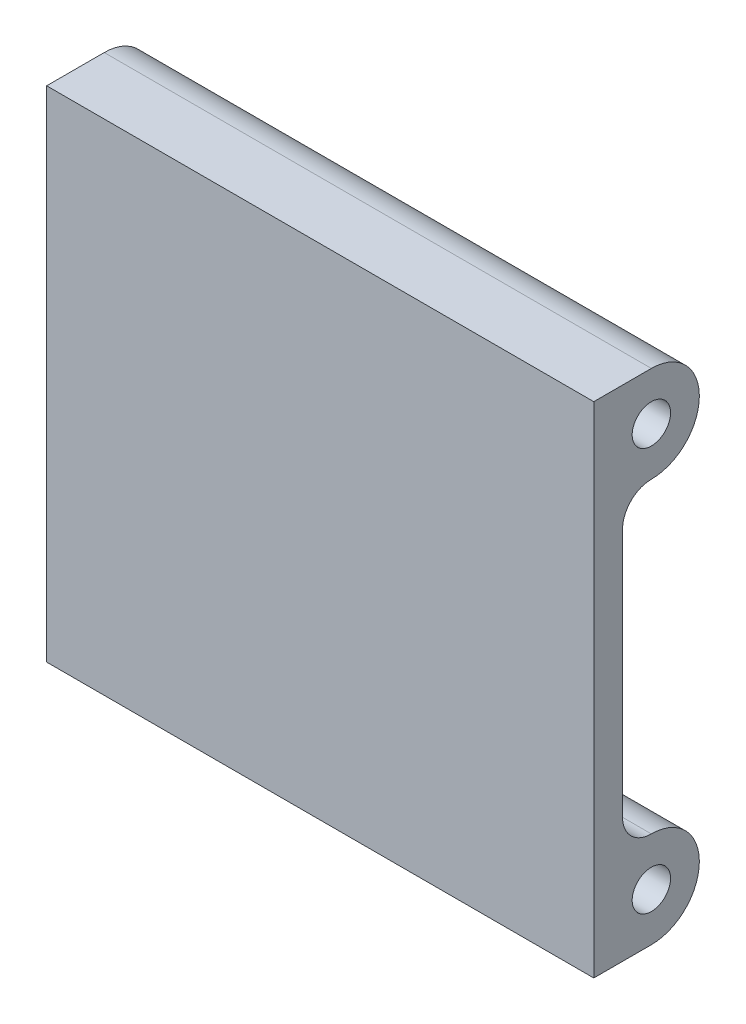
ISO-10303-21;
HEADER;
FILE_DESCRIPTION(('STEP AP214'),'2;1');
FILE_NAME('part.step','',(''),(''),'','','');
FILE_SCHEMA(('AUTOMOTIVE_DESIGN { 1 0 10303 214 1 1 1 1 }'));
ENDSEC;
DATA;
#1=APPLICATION_CONTEXT('core data for automotive mechanical design processes');
#2=APPLICATION_PROTOCOL_DEFINITION('international standard','automotive_design',2000,#1);
#3=PRODUCT_CONTEXT('',#1,'mechanical');
#4=PRODUCT('Part','Part','',(#3));
#5=PRODUCT_RELATED_PRODUCT_CATEGORY('part','',(#4));
#6=PRODUCT_DEFINITION_FORMATION('','',#4);
#7=PRODUCT_DEFINITION_CONTEXT('part definition',#1,'design');
#8=PRODUCT_DEFINITION('design','',#6,#7);
#9=PRODUCT_DEFINITION_SHAPE('','',#8);
#10=(LENGTH_UNIT() NAMED_UNIT(*) SI_UNIT(.MILLI.,.METRE.));
#11=(NAMED_UNIT(*) PLANE_ANGLE_UNIT() SI_UNIT($,.RADIAN.));
#12=(NAMED_UNIT(*) SI_UNIT($,.STERADIAN.) SOLID_ANGLE_UNIT());
#13=UNCERTAINTY_MEASURE_WITH_UNIT(LENGTH_MEASURE(1.E-05),#10,'distance_accuracy_value','');
#14=(GEOMETRIC_REPRESENTATION_CONTEXT(3) GLOBAL_UNCERTAINTY_ASSIGNED_CONTEXT((#13)) GLOBAL_UNIT_ASSIGNED_CONTEXT((#10,
#11,#12)) REPRESENTATION_CONTEXT('',''));
#15=CARTESIAN_POINT('',(0.,0.,0.));
#16=DIRECTION('',(0.,0.,1.));
#17=DIRECTION('',(1.,0.,0.));
#18=AXIS2_PLACEMENT_3D('',#15,#16,#17);
#19=CARTESIAN_POINT('',(28.5,5.,-6.));
#20=DIRECTION('',(1.,0.,0.));
#21=DIRECTION('',(0.,0.,-1.));
#22=AXIS2_PLACEMENT_3D('',#19,#20,#21);
#23=PLANE('',#22);
#24=CARTESIAN_POINT('',(28.5,47.,-6.));
#25=DIRECTION('',(1.,0.,0.));
#26=DIRECTION('',(0.,0.,1.));
#27=AXIS2_PLACEMENT_3D('',#24,#25,#26);
#28=CIRCLE('',#27,2.);
#29=CARTESIAN_POINT('',(28.5,47.,-4.));
#30=VERTEX_POINT('',#29);
#31=EDGE_CURVE('E152',#30,#30,#28,.T.);
#32=ORIENTED_EDGE('',*,*,#31,.F.);
#33=EDGE_LOOP('',(#32));
#34=FACE_BOUND('',#33,.T.);
#35=DIRECTION('',(0.,-1.,0.));
#36=VECTOR('',#35,1.);
#37=CARTESIAN_POINT('',(28.5,52.,0.));
#38=LINE('',#37,#36);
#39=CARTESIAN_POINT('',(28.5,52.,0.));
#40=VERTEX_POINT('',#39);
#41=CARTESIAN_POINT('',(28.5,0.,0.));
#42=VERTEX_POINT('',#41);
#43=EDGE_CURVE('E170',#40,#42,#38,.T.);
#44=ORIENTED_EDGE('',*,*,#43,.T.);
#45=DIRECTION('',(0.,0.,-1.));
#46=VECTOR('',#45,1.);
#47=CARTESIAN_POINT('',(28.5,0.,0.));
#48=LINE('',#47,#46);
#49=CARTESIAN_POINT('',(28.5,0.,-6.));
#50=VERTEX_POINT('',#49);
#51=EDGE_CURVE('E106',#42,#50,#48,.T.);
#52=ORIENTED_EDGE('',*,*,#51,.T.);
#53=CARTESIAN_POINT('',(28.5,5.,-6.));
#54=DIRECTION('',(1.,0.,0.));
#55=DIRECTION('',(0.,0.,-1.));
#56=AXIS2_PLACEMENT_3D('',#53,#54,#55);
#57=CIRCLE('',#56,5.);
#58=CARTESIAN_POINT('',(28.5,10.,-6.));
#59=VERTEX_POINT('',#58);
#60=EDGE_CURVE('E191',#50,#59,#57,.T.);
#61=ORIENTED_EDGE('',*,*,#60,.T.);
#62=CARTESIAN_POINT('',(28.5,13.,-6.));
#63=DIRECTION('',(-1.,0.,0.));
#64=DIRECTION('',(0.,0.,1.));
#65=AXIS2_PLACEMENT_3D('',#62,#63,#64);
#66=CIRCLE('',#65,3.);
#67=CARTESIAN_POINT('',(28.5,13.,-3.));
#68=VERTEX_POINT('',#67);
#69=EDGE_CURVE('E205',#59,#68,#66,.T.);
#70=ORIENTED_EDGE('',*,*,#69,.T.);
#71=DIRECTION('',(0.,1.,0.));
#72=VECTOR('',#71,1.);
#73=CARTESIAN_POINT('',(28.5,13.,-3.));
#74=LINE('',#73,#72);
#75=CARTESIAN_POINT('',(28.5,39.,-3.));
#76=VERTEX_POINT('',#75);
#77=EDGE_CURVE('E125',#68,#76,#74,.T.);
#78=ORIENTED_EDGE('',*,*,#77,.T.);
#79=CARTESIAN_POINT('',(28.5,39.,-6.));
#80=DIRECTION('',(-1.,0.,0.));
#81=DIRECTION('',(0.,0.,-1.));
#82=AXIS2_PLACEMENT_3D('',#79,#80,#81);
#83=CIRCLE('',#82,3.);
#84=CARTESIAN_POINT('',(28.5,42.,-6.));
#85=VERTEX_POINT('',#84);
#86=EDGE_CURVE('E119',#76,#85,#83,.T.);
#87=ORIENTED_EDGE('',*,*,#86,.T.);
#88=CARTESIAN_POINT('',(28.5,47.,-6.));
#89=DIRECTION('',(1.,0.,0.));
#90=DIRECTION('',(0.,0.,1.));
#91=AXIS2_PLACEMENT_3D('',#88,#89,#90);
#92=CIRCLE('',#91,5.);
#93=CARTESIAN_POINT('',(28.5,52.,-6.));
#94=VERTEX_POINT('',#93);
#95=EDGE_CURVE('E123',#85,#94,#92,.T.);
#96=ORIENTED_EDGE('',*,*,#95,.T.);
#97=DIRECTION('',(0.,0.,1.));
#98=VECTOR('',#97,1.);
#99=CARTESIAN_POINT('',(28.5,52.,0.));
#100=LINE('',#99,#98);
#101=EDGE_CURVE('E63',#94,#40,#100,.T.);
#102=ORIENTED_EDGE('',*,*,#101,.T.);
#103=EDGE_LOOP('',(#44,#52,#61,#70,#78,#87,#96,#102));
#104=FACE_BOUND('',#103,.T.);
#105=CARTESIAN_POINT('',(28.5,5.,-6.));
#106=DIRECTION('',(1.,0.,0.));
#107=DIRECTION('',(0.,0.,-1.));
#108=AXIS2_PLACEMENT_3D('',#105,#106,#107);
#109=CIRCLE('',#108,2.);
#110=CARTESIAN_POINT('',(28.5,5.,-4.));
#111=VERTEX_POINT('',#110);
#112=EDGE_CURVE('E219',#111,#111,#109,.T.);
#113=ORIENTED_EDGE('',*,*,#112,.F.);
#114=EDGE_LOOP('',(#113));
#115=FACE_BOUND('',#114,.T.);
#116=ADVANCED_FACE('F45',(#34,#104,#115),#23,.T.);
#117=CARTESIAN_POINT('',(-28.5,5.,-6.));
#118=DIRECTION('',(1.,0.,0.));
#119=DIRECTION('',(0.,0.,-1.));
#120=AXIS2_PLACEMENT_3D('',#117,#118,#119);
#121=PLANE('',#120);
#122=DIRECTION('',(0.,-1.,0.));
#123=VECTOR('',#122,1.);
#124=CARTESIAN_POINT('',(-28.5,52.,0.));
#125=LINE('',#124,#123);
#126=CARTESIAN_POINT('',(-28.5,52.,0.));
#127=VERTEX_POINT('',#126);
#128=CARTESIAN_POINT('',(-28.5,0.,0.));
#129=VERTEX_POINT('',#128);
#130=EDGE_CURVE('E147',#127,#129,#125,.T.);
#131=ORIENTED_EDGE('',*,*,#130,.F.);
#132=DIRECTION('',(0.,0.,1.));
#133=VECTOR('',#132,1.);
#134=CARTESIAN_POINT('',(-28.5,52.,0.));
#135=LINE('',#134,#133);
#136=CARTESIAN_POINT('',(-28.5,52.,-6.));
#137=VERTEX_POINT('',#136);
#138=EDGE_CURVE('E98',#137,#127,#135,.T.);
#139=ORIENTED_EDGE('',*,*,#138,.F.);
#140=CARTESIAN_POINT('',(-28.5,47.,-6.));
#141=DIRECTION('',(1.,0.,0.));
#142=DIRECTION('',(0.,0.,1.));
#143=AXIS2_PLACEMENT_3D('',#140,#141,#142);
#144=CIRCLE('',#143,5.);
#145=CARTESIAN_POINT('',(-28.5,42.,-6.));
#146=VERTEX_POINT('',#145);
#147=EDGE_CURVE('E92',#146,#137,#144,.T.);
#148=ORIENTED_EDGE('',*,*,#147,.F.);
#149=CARTESIAN_POINT('',(-28.5,39.,-6.));
#150=DIRECTION('',(-1.,0.,0.));
#151=DIRECTION('',(0.,0.,-1.));
#152=AXIS2_PLACEMENT_3D('',#149,#150,#151);
#153=CIRCLE('',#152,3.);
#154=CARTESIAN_POINT('',(-28.5,39.,-3.));
#155=VERTEX_POINT('',#154);
#156=EDGE_CURVE('E134',#155,#146,#153,.T.);
#157=ORIENTED_EDGE('',*,*,#156,.F.);
#158=DIRECTION('',(0.,1.,0.));
#159=VECTOR('',#158,1.);
#160=CARTESIAN_POINT('',(-28.5,13.,-3.));
#161=LINE('',#160,#159);
#162=CARTESIAN_POINT('',(-28.5,13.,-3.));
#163=VERTEX_POINT('',#162);
#164=EDGE_CURVE('E161',#163,#155,#161,.T.);
#165=ORIENTED_EDGE('',*,*,#164,.F.);
#166=CARTESIAN_POINT('',(-28.5,13.,-6.));
#167=DIRECTION('',(-1.,0.,0.));
#168=DIRECTION('',(0.,0.,1.));
#169=AXIS2_PLACEMENT_3D('',#166,#167,#168);
#170=CIRCLE('',#169,3.);
#171=CARTESIAN_POINT('',(-28.5,10.,-6.));
#172=VERTEX_POINT('',#171);
#173=EDGE_CURVE('E158',#172,#163,#170,.T.);
#174=ORIENTED_EDGE('',*,*,#173,.F.);
#175=CARTESIAN_POINT('',(-28.5,5.,-6.));
#176=DIRECTION('',(1.,0.,0.));
#177=DIRECTION('',(0.,0.,-1.));
#178=AXIS2_PLACEMENT_3D('',#175,#176,#177);
#179=CIRCLE('',#178,5.);
#180=CARTESIAN_POINT('',(-28.5,0.,-6.));
#181=VERTEX_POINT('',#180);
#182=EDGE_CURVE('E155',#181,#172,#179,.T.);
#183=ORIENTED_EDGE('',*,*,#182,.F.);
#184=DIRECTION('',(0.,0.,-1.));
#185=VECTOR('',#184,1.);
#186=CARTESIAN_POINT('',(-28.5,0.,0.));
#187=LINE('',#186,#185);
#188=EDGE_CURVE('E151',#129,#181,#187,.T.);
#189=ORIENTED_EDGE('',*,*,#188,.F.);
#190=EDGE_LOOP('',(#131,#139,#148,#157,#165,#174,#183,#189));
#191=FACE_BOUND('',#190,.T.);
#192=CARTESIAN_POINT('',(-28.5,47.,-6.));
#193=DIRECTION('',(1.,0.,0.));
#194=DIRECTION('',(0.,0.,1.));
#195=AXIS2_PLACEMENT_3D('',#192,#193,#194);
#196=CIRCLE('',#195,2.);
#197=CARTESIAN_POINT('',(-28.5,47.,-4.));
#198=VERTEX_POINT('',#197);
#199=EDGE_CURVE('E215',#198,#198,#196,.T.);
#200=ORIENTED_EDGE('',*,*,#199,.T.);
#201=EDGE_LOOP('',(#200));
#202=FACE_BOUND('',#201,.T.);
#203=CARTESIAN_POINT('',(-28.5,5.,-6.));
#204=DIRECTION('',(1.,0.,0.));
#205=DIRECTION('',(0.,0.,-1.));
#206=AXIS2_PLACEMENT_3D('',#203,#204,#205);
#207=CIRCLE('',#206,2.);
#208=CARTESIAN_POINT('',(-28.5,5.,-4.));
#209=VERTEX_POINT('',#208);
#210=EDGE_CURVE('E223',#209,#209,#207,.T.);
#211=ORIENTED_EDGE('',*,*,#210,.T.);
#212=EDGE_LOOP('',(#211));
#213=FACE_BOUND('',#212,.T.);
#214=ADVANCED_FACE('F195',(#191,#202,#213),#121,.F.);
#215=CARTESIAN_POINT('',(28.5,52.,0.));
#216=DIRECTION('',(0.,0.,-1.));
#217=DIRECTION('',(-1.,0.,0.));
#218=AXIS2_PLACEMENT_3D('',#215,#216,#217);
#219=PLANE('',#218);
#220=ORIENTED_EDGE('',*,*,#130,.T.);
#221=DIRECTION('',(-1.,0.,0.));
#222=VECTOR('',#221,1.);
#223=CARTESIAN_POINT('',(28.5,0.,0.));
#224=LINE('',#223,#222);
#225=EDGE_CURVE('E11',#42,#129,#224,.T.);
#226=ORIENTED_EDGE('',*,*,#225,.F.);
#227=ORIENTED_EDGE('',*,*,#43,.F.);
#228=DIRECTION('',(-1.,0.,0.));
#229=VECTOR('',#228,1.);
#230=CARTESIAN_POINT('',(28.5,52.,0.));
#231=LINE('',#230,#229);
#232=EDGE_CURVE('E143',#40,#127,#231,.T.);
#233=ORIENTED_EDGE('',*,*,#232,.T.);
#234=EDGE_LOOP('',(#220,#226,#227,#233));
#235=FACE_BOUND('',#234,.T.);
#236=ADVANCED_FACE('F47',(#235),#219,.F.);
#237=CARTESIAN_POINT('',(28.5,0.,0.));
#238=DIRECTION('',(0.,1.,0.));
#239=DIRECTION('',(0.,0.,1.));
#240=AXIS2_PLACEMENT_3D('',#237,#238,#239);
#241=PLANE('',#240);
#242=ORIENTED_EDGE('',*,*,#188,.T.);
#243=DIRECTION('',(-1.,0.,0.));
#244=VECTOR('',#243,1.);
#245=CARTESIAN_POINT('',(28.5,0.,-6.));
#246=LINE('',#245,#244);
#247=EDGE_CURVE('E55',#50,#181,#246,.T.);
#248=ORIENTED_EDGE('',*,*,#247,.F.);
#249=ORIENTED_EDGE('',*,*,#51,.F.);
#250=ORIENTED_EDGE('',*,*,#225,.T.);
#251=EDGE_LOOP('',(#242,#248,#249,#250));
#252=FACE_BOUND('',#251,.T.);
#253=ADVANCED_FACE('F257',(#252),#241,.F.);
#254=CARTESIAN_POINT('',(28.5,5.,-6.));
#255=DIRECTION('',(-1.,0.,0.));
#256=DIRECTION('',(0.,0.,1.));
#257=AXIS2_PLACEMENT_3D('',#254,#255,#256);
#258=CYLINDRICAL_SURFACE('',#257,5.);
#259=ORIENTED_EDGE('',*,*,#182,.T.);
#260=DIRECTION('',(-1.,0.,0.));
#261=VECTOR('',#260,1.);
#262=CARTESIAN_POINT('',(28.5,10.,-6.));
#263=LINE('',#262,#261);
#264=EDGE_CURVE('E181',#59,#172,#263,.T.);
#265=ORIENTED_EDGE('',*,*,#264,.F.);
#266=ORIENTED_EDGE('',*,*,#60,.F.);
#267=ORIENTED_EDGE('',*,*,#247,.T.);
#268=EDGE_LOOP('',(#259,#265,#266,#267));
#269=FACE_BOUND('',#268,.T.);
#270=ADVANCED_FACE('F189',(#269),#258,.T.);
#271=CARTESIAN_POINT('',(28.5,13.,-6.));
#272=DIRECTION('',(-1.,0.,0.));
#273=DIRECTION('',(0.,0.,1.));
#274=AXIS2_PLACEMENT_3D('',#271,#272,#273);
#275=CYLINDRICAL_SURFACE('',#274,3.);
#276=ORIENTED_EDGE('',*,*,#173,.T.);
#277=DIRECTION('',(-1.,0.,0.));
#278=VECTOR('',#277,1.);
#279=CARTESIAN_POINT('',(28.5,13.,-3.));
#280=LINE('',#279,#278);
#281=EDGE_CURVE('E177',#68,#163,#280,.T.);
#282=ORIENTED_EDGE('',*,*,#281,.F.);
#283=ORIENTED_EDGE('',*,*,#69,.F.);
#284=ORIENTED_EDGE('',*,*,#264,.T.);
#285=EDGE_LOOP('',(#276,#282,#283,#284));
#286=FACE_BOUND('',#285,.T.);
#287=ADVANCED_FACE('F200',(#286),#275,.F.);
#288=CARTESIAN_POINT('',(28.5,13.,-3.));
#289=DIRECTION('',(0.,0.,1.));
#290=DIRECTION('',(1.,0.,0.));
#291=AXIS2_PLACEMENT_3D('',#288,#289,#290);
#292=PLANE('',#291);
#293=ORIENTED_EDGE('',*,*,#164,.T.);
#294=DIRECTION('',(-1.,0.,0.));
#295=VECTOR('',#294,1.);
#296=CARTESIAN_POINT('',(28.5,39.,-3.));
#297=LINE('',#296,#295);
#298=EDGE_CURVE('E136',#76,#155,#297,.T.);
#299=ORIENTED_EDGE('',*,*,#298,.F.);
#300=ORIENTED_EDGE('',*,*,#77,.F.);
#301=ORIENTED_EDGE('',*,*,#281,.T.);
#302=EDGE_LOOP('',(#293,#299,#300,#301));
#303=FACE_BOUND('',#302,.T.);
#304=ADVANCED_FACE('F203',(#303),#292,.F.);
#305=CARTESIAN_POINT('',(28.5,39.,-6.));
#306=DIRECTION('',(-1.,0.,0.));
#307=DIRECTION('',(0.,0.,1.));
#308=AXIS2_PLACEMENT_3D('',#305,#306,#307);
#309=CYLINDRICAL_SURFACE('',#308,3.);
#310=ORIENTED_EDGE('',*,*,#156,.T.);
#311=DIRECTION('',(-1.,0.,0.));
#312=VECTOR('',#311,1.);
#313=CARTESIAN_POINT('',(28.5,42.,-6.));
#314=LINE('',#313,#312);
#315=EDGE_CURVE('E131',#85,#146,#314,.T.);
#316=ORIENTED_EDGE('',*,*,#315,.F.);
#317=ORIENTED_EDGE('',*,*,#86,.F.);
#318=ORIENTED_EDGE('',*,*,#298,.T.);
#319=EDGE_LOOP('',(#310,#316,#317,#318));
#320=FACE_BOUND('',#319,.T.);
#321=ADVANCED_FACE('F132',(#320),#309,.F.);
#322=CARTESIAN_POINT('',(28.5,47.,-6.));
#323=DIRECTION('',(-1.,0.,0.));
#324=DIRECTION('',(0.,0.,1.));
#325=AXIS2_PLACEMENT_3D('',#322,#323,#324);
#326=CYLINDRICAL_SURFACE('',#325,5.);
#327=ORIENTED_EDGE('',*,*,#147,.T.);
#328=DIRECTION('',(-1.,0.,0.));
#329=VECTOR('',#328,1.);
#330=CARTESIAN_POINT('',(28.5,52.,-6.));
#331=LINE('',#330,#329);
#332=EDGE_CURVE('E137',#94,#137,#331,.T.);
#333=ORIENTED_EDGE('',*,*,#332,.F.);
#334=ORIENTED_EDGE('',*,*,#95,.F.);
#335=ORIENTED_EDGE('',*,*,#315,.T.);
#336=EDGE_LOOP('',(#327,#333,#334,#335));
#337=FACE_BOUND('',#336,.T.);
#338=ADVANCED_FACE('F139',(#337),#326,.T.);
#339=CARTESIAN_POINT('',(28.5,52.,0.));
#340=DIRECTION('',(0.,-1.,0.));
#341=DIRECTION('',(0.,0.,-1.));
#342=AXIS2_PLACEMENT_3D('',#339,#340,#341);
#343=PLANE('',#342);
#344=ORIENTED_EDGE('',*,*,#138,.T.);
#345=ORIENTED_EDGE('',*,*,#232,.F.);
#346=ORIENTED_EDGE('',*,*,#101,.F.);
#347=ORIENTED_EDGE('',*,*,#332,.T.);
#348=EDGE_LOOP('',(#344,#345,#346,#347));
#349=FACE_BOUND('',#348,.T.);
#350=ADVANCED_FACE('F245',(#349),#343,.F.);
#351=CARTESIAN_POINT('',(28.5,47.,-6.));
#352=DIRECTION('',(-1.,0.,0.));
#353=DIRECTION('',(0.,0.,1.));
#354=AXIS2_PLACEMENT_3D('',#351,#352,#353);
#355=CYLINDRICAL_SURFACE('',#354,2.);
#356=CARTESIAN_POINT('',(28.5,47.,-4.));
#357=CARTESIAN_POINT('',(27.90625,47.,-4.));
#358=CARTESIAN_POINT('',(27.3125,47.,-4.));
#359=CARTESIAN_POINT('',(26.125,47.,-4.));
#360=CARTESIAN_POINT('',(25.53125,47.,-4.));
#361=CARTESIAN_POINT('',(24.34375,47.,-4.));
#362=CARTESIAN_POINT('',(23.75,47.,-4.));
#363=CARTESIAN_POINT('',(22.5625,47.,-4.));
#364=CARTESIAN_POINT('',(21.96875,47.,-4.));
#365=CARTESIAN_POINT('',(20.78125,47.,-4.));
#366=CARTESIAN_POINT('',(20.1875,47.,-4.));
#367=CARTESIAN_POINT('',(19.,47.,-4.));
#368=CARTESIAN_POINT('',(18.40625,47.,-4.));
#369=CARTESIAN_POINT('',(17.21875,47.,-4.));
#370=CARTESIAN_POINT('',(16.625,47.,-4.));
#371=CARTESIAN_POINT('',(15.4375,47.,-4.));
#372=CARTESIAN_POINT('',(14.84375,47.,-4.));
#373=CARTESIAN_POINT('',(13.65625,47.,-4.));
#374=CARTESIAN_POINT('',(13.0625,47.,-4.));
#375=CARTESIAN_POINT('',(11.875,47.,-4.));
#376=CARTESIAN_POINT('',(11.28125,47.,-4.));
#377=CARTESIAN_POINT('',(10.09375,47.,-4.));
#378=CARTESIAN_POINT('',(9.5,47.,-4.));
#379=CARTESIAN_POINT('',(8.3125,47.,-4.));
#380=CARTESIAN_POINT('',(7.71875,47.,-4.));
#381=CARTESIAN_POINT('',(6.53125,47.,-4.));
#382=CARTESIAN_POINT('',(5.9375,47.,-4.));
#383=CARTESIAN_POINT('',(4.75,47.,-4.));
#384=CARTESIAN_POINT('',(4.15625,47.,-4.));
#385=CARTESIAN_POINT('',(2.96875,47.,-4.));
#386=CARTESIAN_POINT('',(2.375,47.,-4.));
#387=CARTESIAN_POINT('',(1.1875,47.,-4.));
#388=CARTESIAN_POINT('',(0.593750000000001,47.,-4.));
#389=CARTESIAN_POINT('',(-0.593750000000001,47.,-4.));
#390=CARTESIAN_POINT('',(-1.1875,47.,-4.));
#391=CARTESIAN_POINT('',(-2.375,47.,-4.));
#392=CARTESIAN_POINT('',(-2.96875,47.,-4.));
#393=CARTESIAN_POINT('',(-4.15625,47.,-4.));
#394=CARTESIAN_POINT('',(-4.75,47.,-4.));
#395=CARTESIAN_POINT('',(-5.9375,47.,-4.));
#396=CARTESIAN_POINT('',(-6.53125,47.,-4.));
#397=CARTESIAN_POINT('',(-7.71875,47.,-4.));
#398=CARTESIAN_POINT('',(-8.3125,47.,-4.));
#399=CARTESIAN_POINT('',(-9.5,47.,-4.));
#400=CARTESIAN_POINT('',(-10.09375,47.,-4.));
#401=CARTESIAN_POINT('',(-11.28125,47.,-4.));
#402=CARTESIAN_POINT('',(-11.875,47.,-4.));
#403=CARTESIAN_POINT('',(-13.0625,47.,-4.));
#404=CARTESIAN_POINT('',(-13.65625,47.,-4.));
#405=CARTESIAN_POINT('',(-14.84375,47.,-4.));
#406=CARTESIAN_POINT('',(-15.4375,47.,-4.));
#407=CARTESIAN_POINT('',(-16.625,47.,-4.));
#408=CARTESIAN_POINT('',(-17.21875,47.,-4.));
#409=CARTESIAN_POINT('',(-18.40625,47.,-4.));
#410=CARTESIAN_POINT('',(-19.,47.,-4.));
#411=CARTESIAN_POINT('',(-20.1875,47.,-4.));
#412=CARTESIAN_POINT('',(-20.78125,47.,-4.));
#413=CARTESIAN_POINT('',(-21.96875,47.,-4.));
#414=CARTESIAN_POINT('',(-22.5625,47.,-4.));
#415=CARTESIAN_POINT('',(-23.75,47.,-4.));
#416=CARTESIAN_POINT('',(-24.34375,47.,-4.));
#417=CARTESIAN_POINT('',(-25.53125,47.,-4.));
#418=CARTESIAN_POINT('',(-26.125,47.,-4.));
#419=CARTESIAN_POINT('',(-27.3125,47.,-4.));
#420=CARTESIAN_POINT('',(-27.90625,47.,-4.));
#421=CARTESIAN_POINT('',(-28.5,47.,-4.));
#422=B_SPLINE_CURVE_WITH_KNOTS('',3,(#356,#357,#358,#359,#360,#361,#362,#363,#364,#365,#366,
#367,#368,#369,#370,#371,#372,#373,#374,#375,#376,#377,#378,#379,#380,#381,#382,#383,#384,#385,
#386,#387,#388,#389,#390,#391,#392,#393,#394,#395,#396,#397,#398,#399,#400,#401,#402,#403,#404,
#405,#406,#407,#408,#409,#410,#411,#412,#413,#414,#415,#416,#417,#418,#419,#420,#421),
.UNSPECIFIED.,.F.,.F.,(4,2,2,2,2,2,2,2,2,2,2,2,2,2,2,2,2,2,2,2,2,2,2,2,2,2,2,2,2,2,2,2,4),(0.,
1.78125,3.5625,5.34375,7.125,8.90625,10.6875,12.46875,14.25,16.03125,17.8125,19.59375,21.375,
23.15625,24.9375,26.71875,28.5,30.28125,32.0625,33.84375,35.625,37.40625,39.1875,40.96875,42.75,
44.53125,46.3125,48.09375,49.875,51.65625,53.4375,55.21875,57.),.UNSPECIFIED.);
#423=EDGE_CURVE('BSEAM242',#30,#198,#422,.T.);
#424=ORIENTED_EDGE('',*,*,#31,.T.);
#425=ORIENTED_EDGE('',*,*,#199,.F.);
#426=ORIENTED_EDGE('',*,*,#423,.T.);
#427=ORIENTED_EDGE('',*,*,#423,.F.);
#428=EDGE_LOOP('',(#424,#426,#425,#427));
#429=FACE_BOUND('',#428,.T.);
#430=ADVANCED_FACE('F242',(#429),#355,.F.);
#431=CARTESIAN_POINT('',(28.5,5.,-6.));
#432=DIRECTION('',(-1.,0.,0.));
#433=DIRECTION('',(0.,0.,1.));
#434=AXIS2_PLACEMENT_3D('',#431,#432,#433);
#435=CYLINDRICAL_SURFACE('',#434,2.);
#436=CARTESIAN_POINT('',(28.5,5.,-4.));
#437=CARTESIAN_POINT('',(27.90625,5.,-4.));
#438=CARTESIAN_POINT('',(27.3125,5.,-4.));
#439=CARTESIAN_POINT('',(26.125,5.,-4.));
#440=CARTESIAN_POINT('',(25.53125,5.,-4.));
#441=CARTESIAN_POINT('',(24.34375,5.,-4.));
#442=CARTESIAN_POINT('',(23.75,5.,-4.));
#443=CARTESIAN_POINT('',(22.5625,5.,-4.));
#444=CARTESIAN_POINT('',(21.96875,5.,-4.));
#445=CARTESIAN_POINT('',(20.78125,5.,-4.));
#446=CARTESIAN_POINT('',(20.1875,5.,-4.));
#447=CARTESIAN_POINT('',(19.,5.,-4.));
#448=CARTESIAN_POINT('',(18.40625,5.,-4.));
#449=CARTESIAN_POINT('',(17.21875,5.,-4.));
#450=CARTESIAN_POINT('',(16.625,5.,-4.));
#451=CARTESIAN_POINT('',(15.4375,5.,-4.));
#452=CARTESIAN_POINT('',(14.84375,5.,-4.));
#453=CARTESIAN_POINT('',(13.65625,5.,-4.));
#454=CARTESIAN_POINT('',(13.0625,5.,-4.));
#455=CARTESIAN_POINT('',(11.875,5.,-4.));
#456=CARTESIAN_POINT('',(11.28125,5.,-4.));
#457=CARTESIAN_POINT('',(10.09375,5.,-4.));
#458=CARTESIAN_POINT('',(9.5,5.,-4.));
#459=CARTESIAN_POINT('',(8.3125,5.,-4.));
#460=CARTESIAN_POINT('',(7.71875,5.,-4.));
#461=CARTESIAN_POINT('',(6.53125,5.,-4.));
#462=CARTESIAN_POINT('',(5.9375,5.,-4.));
#463=CARTESIAN_POINT('',(4.75,5.,-4.));
#464=CARTESIAN_POINT('',(4.15625,5.,-4.));
#465=CARTESIAN_POINT('',(2.96875,5.,-4.));
#466=CARTESIAN_POINT('',(2.375,5.,-4.));
#467=CARTESIAN_POINT('',(1.1875,5.,-4.));
#468=CARTESIAN_POINT('',(0.593750000000001,5.,-4.));
#469=CARTESIAN_POINT('',(-0.593750000000001,5.,-4.));
#470=CARTESIAN_POINT('',(-1.1875,5.,-4.));
#471=CARTESIAN_POINT('',(-2.375,5.,-4.));
#472=CARTESIAN_POINT('',(-2.96875,5.,-4.));
#473=CARTESIAN_POINT('',(-4.15625,5.,-4.));
#474=CARTESIAN_POINT('',(-4.75,5.,-4.));
#475=CARTESIAN_POINT('',(-5.9375,5.,-4.));
#476=CARTESIAN_POINT('',(-6.53125,5.,-4.));
#477=CARTESIAN_POINT('',(-7.71875,5.,-4.));
#478=CARTESIAN_POINT('',(-8.3125,5.,-4.));
#479=CARTESIAN_POINT('',(-9.5,5.,-4.));
#480=CARTESIAN_POINT('',(-10.09375,5.,-4.));
#481=CARTESIAN_POINT('',(-11.28125,5.,-4.));
#482=CARTESIAN_POINT('',(-11.875,5.,-4.));
#483=CARTESIAN_POINT('',(-13.0625,5.,-4.));
#484=CARTESIAN_POINT('',(-13.65625,5.,-4.));
#485=CARTESIAN_POINT('',(-14.84375,5.,-4.));
#486=CARTESIAN_POINT('',(-15.4375,5.,-4.));
#487=CARTESIAN_POINT('',(-16.625,5.,-4.));
#488=CARTESIAN_POINT('',(-17.21875,5.,-4.));
#489=CARTESIAN_POINT('',(-18.40625,5.,-4.));
#490=CARTESIAN_POINT('',(-19.,5.,-4.));
#491=CARTESIAN_POINT('',(-20.1875,5.,-4.));
#492=CARTESIAN_POINT('',(-20.78125,5.,-4.));
#493=CARTESIAN_POINT('',(-21.96875,5.,-4.));
#494=CARTESIAN_POINT('',(-22.5625,5.,-4.));
#495=CARTESIAN_POINT('',(-23.75,5.,-4.));
#496=CARTESIAN_POINT('',(-24.34375,5.,-4.));
#497=CARTESIAN_POINT('',(-25.53125,5.,-4.));
#498=CARTESIAN_POINT('',(-26.125,5.,-4.));
#499=CARTESIAN_POINT('',(-27.3125,5.,-4.));
#500=CARTESIAN_POINT('',(-27.90625,5.,-4.));
#501=CARTESIAN_POINT('',(-28.5,5.,-4.));
#502=B_SPLINE_CURVE_WITH_KNOTS('',3,(#436,#437,#438,#439,#440,#441,#442,#443,#444,#445,#446,
#447,#448,#449,#450,#451,#452,#453,#454,#455,#456,#457,#458,#459,#460,#461,#462,#463,#464,#465,
#466,#467,#468,#469,#470,#471,#472,#473,#474,#475,#476,#477,#478,#479,#480,#481,#482,#483,#484,
#485,#486,#487,#488,#489,#490,#491,#492,#493,#494,#495,#496,#497,#498,#499,#500,#501),
.UNSPECIFIED.,.F.,.F.,(4,2,2,2,2,2,2,2,2,2,2,2,2,2,2,2,2,2,2,2,2,2,2,2,2,2,2,2,2,2,2,2,4),(0.,
1.78125,3.5625,5.34375,7.125,8.90625,10.6875,12.46875,14.25,16.03125,17.8125,19.59375,21.375,
23.15625,24.9375,26.71875,28.5,30.28125,32.0625,33.84375,35.625,37.40625,39.1875,40.96875,42.75,
44.53125,46.3125,48.09375,49.875,51.65625,53.4375,55.21875,57.),.UNSPECIFIED.);
#503=EDGE_CURVE('BSEAM231',#111,#209,#502,.T.);
#504=ORIENTED_EDGE('',*,*,#112,.T.);
#505=ORIENTED_EDGE('',*,*,#210,.F.);
#506=ORIENTED_EDGE('',*,*,#503,.T.);
#507=ORIENTED_EDGE('',*,*,#503,.F.);
#508=EDGE_LOOP('',(#504,#506,#505,#507));
#509=FACE_BOUND('',#508,.T.);
#510=ADVANCED_FACE('F231',(#509),#435,.F.);
#511=CLOSED_SHELL('',(#116,#214,#236,#253,#270,#287,#304,#321,#338,#350,#430,#510));
#512=MANIFOLD_SOLID_BREP('B2',#511);
#513=ADVANCED_BREP_SHAPE_REPRESENTATION('',(#18,#512),#14);
#514=SHAPE_DEFINITION_REPRESENTATION(#9,#513);
ENDSEC;
END-ISO-10303-21;
